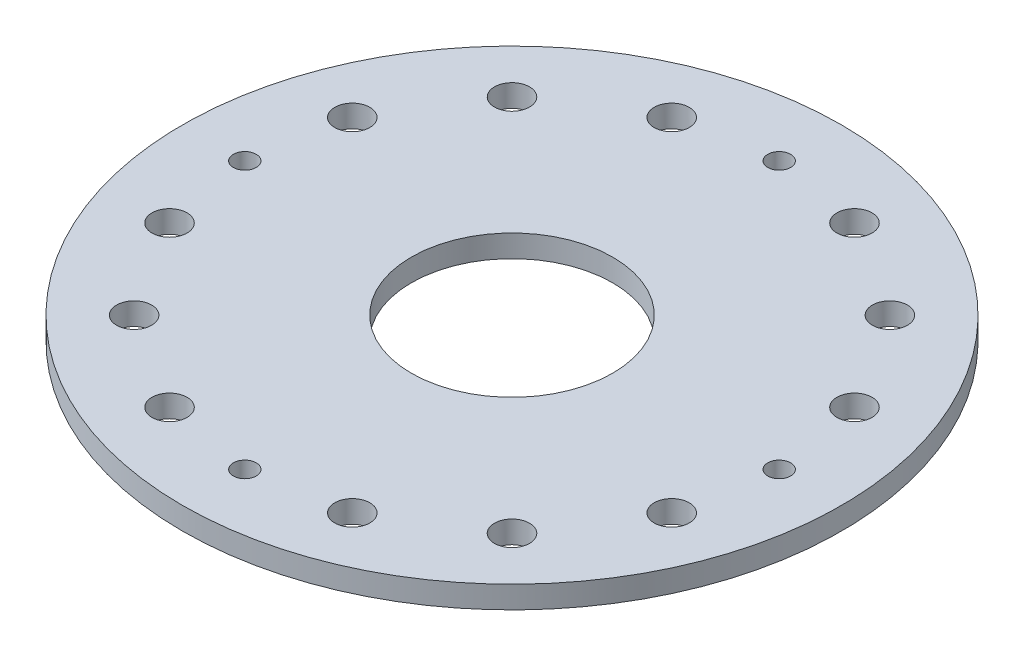
ISO-10303-21;
HEADER;
FILE_DESCRIPTION(('STEP AP214'),'2;1');
FILE_NAME('part.step','',(''),(''),'','','');
FILE_SCHEMA(('AUTOMOTIVE_DESIGN { 1 0 10303 214 1 1 1 1 }'));
ENDSEC;
DATA;
#1=APPLICATION_CONTEXT('core data for automotive mechanical design processes');
#2=APPLICATION_PROTOCOL_DEFINITION('international standard','automotive_design',2000,#1);
#3=PRODUCT_CONTEXT('',#1,'mechanical');
#4=PRODUCT('Part','Part','',(#3));
#5=PRODUCT_RELATED_PRODUCT_CATEGORY('part','',(#4));
#6=PRODUCT_DEFINITION_FORMATION('','',#4);
#7=PRODUCT_DEFINITION_CONTEXT('part definition',#1,'design');
#8=PRODUCT_DEFINITION('design','',#6,#7);
#9=PRODUCT_DEFINITION_SHAPE('','',#8);
#10=(LENGTH_UNIT() NAMED_UNIT(*) SI_UNIT(.MILLI.,.METRE.));
#11=(NAMED_UNIT(*) PLANE_ANGLE_UNIT() SI_UNIT($,.RADIAN.));
#12=(NAMED_UNIT(*) SI_UNIT($,.STERADIAN.) SOLID_ANGLE_UNIT());
#13=UNCERTAINTY_MEASURE_WITH_UNIT(LENGTH_MEASURE(1.E-05),#10,'distance_accuracy_value','');
#14=(GEOMETRIC_REPRESENTATION_CONTEXT(3) GLOBAL_UNCERTAINTY_ASSIGNED_CONTEXT((#13)) GLOBAL_UNIT_ASSIGNED_CONTEXT((#10,
#11,#12)) REPRESENTATION_CONTEXT('',''));
#15=CARTESIAN_POINT('',(0.,0.,0.));
#16=DIRECTION('',(0.,0.,1.));
#17=DIRECTION('',(1.,0.,0.));
#18=AXIS2_PLACEMENT_3D('',#15,#16,#17);
#19=CARTESIAN_POINT('',(0.,3.175,0.));
#20=DIRECTION('',(0.,-1.,0.));
#21=DIRECTION('',(0.,0.,-1.));
#22=AXIS2_PLACEMENT_3D('',#19,#20,#21);
#23=CYLINDRICAL_SURFACE('',#22,46.99);
#24=CARTESIAN_POINT('',(0.,3.175,0.));
#25=DIRECTION('',(0.,1.,0.));
#26=DIRECTION('',(0.,0.,1.));
#27=AXIS2_PLACEMENT_3D('',#24,#25,#26);
#28=CIRCLE('',#27,46.99);
#29=CARTESIAN_POINT('',(0.,3.175,46.99));
#30=VERTEX_POINT('',#29);
#31=EDGE_CURVE('E10',#30,#30,#28,.T.);
#32=ORIENTED_EDGE('',*,*,#31,.F.);
#33=EDGE_LOOP('',(#32));
#34=FACE_BOUND('',#33,.T.);
#35=CARTESIAN_POINT('',(0.,0.,0.));
#36=DIRECTION('',(0.,1.,0.));
#37=DIRECTION('',(0.,0.,1.));
#38=AXIS2_PLACEMENT_3D('',#35,#36,#37);
#39=CIRCLE('',#38,46.99);
#40=CARTESIAN_POINT('',(0.,0.,46.99));
#41=VERTEX_POINT('',#40);
#42=EDGE_CURVE('E38',#41,#41,#39,.T.);
#43=ORIENTED_EDGE('',*,*,#42,.T.);
#44=EDGE_LOOP('',(#43));
#45=FACE_BOUND('',#44,.T.);
#46=ADVANCED_FACE('F31',(#34,#45),#23,.T.);
#47=CARTESIAN_POINT('',(0.,3.175,0.));
#48=DIRECTION('',(0.,1.,0.));
#49=DIRECTION('',(0.,0.,1.));
#50=AXIS2_PLACEMENT_3D('',#47,#48,#49);
#51=PLANE('',#50);
#52=CARTESIAN_POINT('',(35.8022888519431,3.175,-13.0309674607081));
#53=DIRECTION('',(0.,1.,0.));
#54=DIRECTION('',(-0.906307787036654,0.,-0.422618261740691));
#55=AXIS2_PLACEMENT_3D('',#52,#53,#54);
#56=CIRCLE('',#55,2.5);
#57=CARTESIAN_POINT('',(33.5365193843514,3.175,-14.0875131150599));
#58=VERTEX_POINT('',#57);
#59=EDGE_CURVE('E109',#58,#58,#56,.T.);
#60=ORIENTED_EDGE('',*,*,#59,.F.);
#61=EDGE_LOOP('',(#60));
#62=FACE_BOUND('',#61,.T.);
#63=CARTESIAN_POINT('',(13.0309674607078,3.175,35.8022888519432));
#64=DIRECTION('',(0.,1.,0.));
#65=DIRECTION('',(0.4226182617407,0.,-0.90630778703665));
#66=AXIS2_PLACEMENT_3D('',#63,#64,#65);
#67=CIRCLE('',#66,2.5);
#68=CARTESIAN_POINT('',(14.0875131150595,3.175,33.5365193843516));
#69=VERTEX_POINT('',#68);
#70=EDGE_CURVE('E99',#69,#69,#67,.T.);
#71=ORIENTED_EDGE('',*,*,#70,.F.);
#72=EDGE_LOOP('',(#71));
#73=FACE_BOUND('',#72,.T.);
#74=CARTESIAN_POINT('',(-35.8022888519431,3.175,13.0309674607079));
#75=DIRECTION('',(0.,1.,0.));
#76=DIRECTION('',(0.906307787036651,0.,0.422618261740697));
#77=AXIS2_PLACEMENT_3D('',#74,#75,#76);
#78=CIRCLE('',#77,2.5);
#79=CARTESIAN_POINT('',(-33.5365193843515,3.175,14.0875131150596));
#80=VERTEX_POINT('',#79);
#81=EDGE_CURVE('E96',#80,#80,#78,.T.);
#82=ORIENTED_EDGE('',*,*,#81,.F.);
#83=EDGE_LOOP('',(#82));
#84=FACE_BOUND('',#83,.T.);
#85=CARTESIAN_POINT('',(-13.0309674607078,3.175,-35.8022888519432));
#86=DIRECTION('',(0.,1.,0.));
#87=DIRECTION('',(-0.4226182617407,0.,0.90630778703665));
#88=AXIS2_PLACEMENT_3D('',#85,#86,#87);
#89=CIRCLE('',#88,2.5);
#90=CARTESIAN_POINT('',(-14.0875131150595,3.175,-33.5365193843516));
#91=VERTEX_POINT('',#90);
#92=EDGE_CURVE('E93',#91,#91,#89,.T.);
#93=ORIENTED_EDGE('',*,*,#92,.F.);
#94=EDGE_LOOP('',(#93));
#95=FACE_BOUND('',#94,.T.);
#96=CARTESIAN_POINT('',(13.0309674607078,3.175,-35.8022888519432));
#97=DIRECTION('',(0.,1.,0.));
#98=DIRECTION('',(-0.906307787036645,0.,0.42261826174071));
#99=AXIS2_PLACEMENT_3D('',#96,#97,#98);
#100=CIRCLE('',#99,2.5);
#101=CARTESIAN_POINT('',(10.7651979931161,3.175,-34.7457431975914));
#102=VERTEX_POINT('',#101);
#103=EDGE_CURVE('E89',#102,#102,#100,.T.);
#104=ORIENTED_EDGE('',*,*,#103,.F.);
#105=EDGE_LOOP('',(#104));
#106=FACE_BOUND('',#105,.T.);
#107=CARTESIAN_POINT('',(35.8022888519431,3.175,13.0309674607081));
#108=DIRECTION('',(0.,1.,0.));
#109=DIRECTION('',(-0.4226182617407,0.,-0.90630778703665));
#110=AXIS2_PLACEMENT_3D('',#107,#108,#109);
#111=CIRCLE('',#110,2.5);
#112=CARTESIAN_POINT('',(34.7457431975913,3.175,10.7651979931165));
#113=VERTEX_POINT('',#112);
#114=EDGE_CURVE('E85',#113,#113,#111,.T.);
#115=ORIENTED_EDGE('',*,*,#114,.F.);
#116=EDGE_LOOP('',(#115));
#117=FACE_BOUND('',#116,.T.);
#118=CARTESIAN_POINT('',(-13.030967460708,3.175,35.8022888519431));
#119=DIRECTION('',(0.,1.,0.));
#120=DIRECTION('',(0.906307787036648,0.,-0.422618261740703));
#121=AXIS2_PLACEMENT_3D('',#118,#119,#120);
#122=CIRCLE('',#121,2.5);
#123=CARTESIAN_POINT('',(-10.7651979931164,3.175,34.7457431975913));
#124=VERTEX_POINT('',#123);
#125=EDGE_CURVE('E81',#124,#124,#122,.T.);
#126=ORIENTED_EDGE('',*,*,#125,.F.);
#127=EDGE_LOOP('',(#126));
#128=FACE_BOUND('',#127,.T.);
#129=CARTESIAN_POINT('',(-35.8022888519431,3.175,-13.0309674607081));
#130=DIRECTION('',(0.,1.,0.));
#131=DIRECTION('',(0.4226182617407,0.,0.90630778703665));
#132=AXIS2_PLACEMENT_3D('',#129,#130,#131);
#133=CIRCLE('',#132,2.5);
#134=CARTESIAN_POINT('',(-34.7457431975913,3.175,-10.7651979931165));
#135=VERTEX_POINT('',#134);
#136=EDGE_CURVE('E77',#135,#135,#133,.T.);
#137=ORIENTED_EDGE('',*,*,#136,.F.);
#138=EDGE_LOOP('',(#137));
#139=FACE_BOUND('',#138,.T.);
#140=CARTESIAN_POINT('',(26.9407683632073,3.175,-26.9407683632076));
#141=DIRECTION('',(0.,1.,0.));
#142=DIRECTION('',(-1.,0.,0.));
#143=AXIS2_PLACEMENT_3D('',#140,#141,#142);
#144=CIRCLE('',#143,2.5);
#145=CARTESIAN_POINT('',(24.4407683632073,3.175,-26.9407683632076));
#146=VERTEX_POINT('',#145);
#147=EDGE_CURVE('E73',#146,#146,#144,.T.);
#148=ORIENTED_EDGE('',*,*,#147,.F.);
#149=EDGE_LOOP('',(#148));
#150=FACE_BOUND('',#149,.T.);
#151=CARTESIAN_POINT('',(26.9407683632073,3.175,26.9407683632076));
#152=DIRECTION('',(0.,1.,0.));
#153=DIRECTION('',(0.,0.,-1.));
#154=AXIS2_PLACEMENT_3D('',#151,#152,#153);
#155=CIRCLE('',#154,2.5);
#156=CARTESIAN_POINT('',(26.9407683632073,3.175,24.4407683632076));
#157=VERTEX_POINT('',#156);
#158=EDGE_CURVE('E69',#157,#157,#155,.T.);
#159=ORIENTED_EDGE('',*,*,#158,.F.);
#160=EDGE_LOOP('',(#159));
#161=FACE_BOUND('',#160,.T.);
#162=CARTESIAN_POINT('',(-26.9407683632075,3.175,26.9407683632074));
#163=DIRECTION('',(0.,1.,0.));
#164=DIRECTION('',(1.,0.,0.));
#165=AXIS2_PLACEMENT_3D('',#162,#163,#164);
#166=CIRCLE('',#165,2.5);
#167=CARTESIAN_POINT('',(-24.4407683632075,3.175,26.9407683632074));
#168=VERTEX_POINT('',#167);
#169=EDGE_CURVE('E65',#168,#168,#166,.T.);
#170=ORIENTED_EDGE('',*,*,#169,.F.);
#171=EDGE_LOOP('',(#170));
#172=FACE_BOUND('',#171,.T.);
#173=CARTESIAN_POINT('',(-26.9407683632073,3.175,-26.9407683632076));
#174=DIRECTION('',(0.,1.,0.));
#175=DIRECTION('',(0.,0.,1.));
#176=AXIS2_PLACEMENT_3D('',#173,#174,#175);
#177=CIRCLE('',#176,2.5);
#178=CARTESIAN_POINT('',(-26.9407683632073,3.175,-24.4407683632076));
#179=VERTEX_POINT('',#178);
#180=EDGE_CURVE('E61',#179,#179,#177,.T.);
#181=ORIENTED_EDGE('',*,*,#180,.F.);
#182=EDGE_LOOP('',(#181));
#183=FACE_BOUND('',#182,.T.);
#184=CARTESIAN_POINT('',(38.1,3.175,-3.9907631702977E-13));
#185=DIRECTION('',(0.,1.,0.));
#186=DIRECTION('',(0.,0.,1.));
#187=AXIS2_PLACEMENT_3D('',#184,#185,#186);
#188=CIRCLE('',#187,1.63195);
#189=CARTESIAN_POINT('',(38.1,3.175,1.6319499999996));
#190=VERTEX_POINT('',#189);
#191=EDGE_CURVE('E57',#190,#190,#188,.T.);
#192=ORIENTED_EDGE('',*,*,#191,.F.);
#193=EDGE_LOOP('',(#192));
#194=FACE_BOUND('',#193,.T.);
#195=CARTESIAN_POINT('',(0.,3.175,38.1));
#196=DIRECTION('',(0.,1.,0.));
#197=DIRECTION('',(0.,0.,1.));
#198=AXIS2_PLACEMENT_3D('',#195,#196,#197);
#199=CIRCLE('',#198,1.63195);
#200=CARTESIAN_POINT('',(0.,3.175,39.73195));
#201=VERTEX_POINT('',#200);
#202=EDGE_CURVE('E53',#201,#201,#199,.T.);
#203=ORIENTED_EDGE('',*,*,#202,.F.);
#204=EDGE_LOOP('',(#203));
#205=FACE_BOUND('',#204,.T.);
#206=CARTESIAN_POINT('',(-38.1,3.175,1.33025439009923E-13));
#207=DIRECTION('',(0.,1.,0.));
#208=DIRECTION('',(0.,0.,1.));
#209=AXIS2_PLACEMENT_3D('',#206,#207,#208);
#210=CIRCLE('',#209,1.63195);
#211=CARTESIAN_POINT('',(-38.1,3.175,1.63195000000013));
#212=VERTEX_POINT('',#211);
#213=EDGE_CURVE('E52',#212,#212,#210,.T.);
#214=ORIENTED_EDGE('',*,*,#213,.F.);
#215=EDGE_LOOP('',(#214));
#216=FACE_BOUND('',#215,.T.);
#217=CARTESIAN_POINT('',(0.,3.175,-38.1));
#218=DIRECTION('',(0.,1.,0.));
#219=DIRECTION('',(0.,0.,1.));
#220=AXIS2_PLACEMENT_3D('',#217,#218,#219);
#221=CIRCLE('',#220,1.63195);
#222=CARTESIAN_POINT('',(0.,3.175,-36.46805));
#223=VERTEX_POINT('',#222);
#224=EDGE_CURVE('E139',#223,#223,#221,.T.);
#225=ORIENTED_EDGE('',*,*,#224,.F.);
#226=EDGE_LOOP('',(#225));
#227=FACE_BOUND('',#226,.T.);
#228=CARTESIAN_POINT('',(0.,3.175,0.));
#229=DIRECTION('',(0.,1.,0.));
#230=DIRECTION('',(0.,0.,1.));
#231=AXIS2_PLACEMENT_3D('',#228,#229,#230);
#232=CIRCLE('',#231,14.351);
#233=CARTESIAN_POINT('',(0.,3.175,14.351));
#234=VERTEX_POINT('',#233);
#235=EDGE_CURVE('E46',#234,#234,#232,.T.);
#236=ORIENTED_EDGE('',*,*,#235,.F.);
#237=EDGE_LOOP('',(#236));
#238=FACE_BOUND('',#237,.T.);
#239=ORIENTED_EDGE('',*,*,#31,.T.);
#240=EDGE_LOOP('',(#239));
#241=FACE_BOUND('',#240,.T.);
#242=ADVANCED_FACE('F152',(#62,#73,#84,#95,#106,#117,#128,#139,#150,#161,#172,#183,#194,#205,
#216,#227,#238,#241),#51,.T.);
#243=CARTESIAN_POINT('',(0.,0.,0.));
#244=DIRECTION('',(0.,1.,0.));
#245=DIRECTION('',(0.,0.,1.));
#246=AXIS2_PLACEMENT_3D('',#243,#244,#245);
#247=PLANE('',#246);
#248=CARTESIAN_POINT('',(35.8022888519431,0.,-13.0309674607081));
#249=DIRECTION('',(0.,1.,0.));
#250=DIRECTION('',(0.,0.,1.));
#251=AXIS2_PLACEMENT_3D('',#248,#249,#250);
#252=CIRCLE('',#251,2.5);
#253=CARTESIAN_POINT('',(35.8022888519431,0.,-10.5309674607081));
#254=VERTEX_POINT('',#253);
#255=EDGE_CURVE('E34',#254,#254,#252,.T.);
#256=ORIENTED_EDGE('',*,*,#255,.T.);
#257=EDGE_LOOP('',(#256));
#258=FACE_BOUND('',#257,.T.);
#259=CARTESIAN_POINT('',(13.0309674607078,0.,35.8022888519432));
#260=DIRECTION('',(0.,1.,0.));
#261=DIRECTION('',(0.,0.,1.));
#262=AXIS2_PLACEMENT_3D('',#259,#260,#261);
#263=CIRCLE('',#262,2.5);
#264=CARTESIAN_POINT('',(13.0309674607078,0.,38.3022888519432));
#265=VERTEX_POINT('',#264);
#266=EDGE_CURVE('E97',#265,#265,#263,.T.);
#267=ORIENTED_EDGE('',*,*,#266,.T.);
#268=EDGE_LOOP('',(#267));
#269=FACE_BOUND('',#268,.T.);
#270=CARTESIAN_POINT('',(-35.8022888519431,0.,13.0309674607079));
#271=DIRECTION('',(0.,1.,0.));
#272=DIRECTION('',(0.,0.,1.));
#273=AXIS2_PLACEMENT_3D('',#270,#271,#272);
#274=CIRCLE('',#273,2.5);
#275=CARTESIAN_POINT('',(-35.8022888519431,0.,15.5309674607079));
#276=VERTEX_POINT('',#275);
#277=EDGE_CURVE('E94',#276,#276,#274,.T.);
#278=ORIENTED_EDGE('',*,*,#277,.T.);
#279=EDGE_LOOP('',(#278));
#280=FACE_BOUND('',#279,.T.);
#281=CARTESIAN_POINT('',(-13.0309674607078,0.,-35.8022888519432));
#282=DIRECTION('',(0.,1.,0.));
#283=DIRECTION('',(0.,0.,1.));
#284=AXIS2_PLACEMENT_3D('',#281,#282,#283);
#285=CIRCLE('',#284,2.5);
#286=CARTESIAN_POINT('',(-13.0309674607078,0.,-33.3022888519432));
#287=VERTEX_POINT('',#286);
#288=EDGE_CURVE('E90',#287,#287,#285,.T.);
#289=ORIENTED_EDGE('',*,*,#288,.T.);
#290=EDGE_LOOP('',(#289));
#291=FACE_BOUND('',#290,.T.);
#292=CARTESIAN_POINT('',(13.0309674607078,0.,-35.8022888519432));
#293=DIRECTION('',(0.,1.,0.));
#294=DIRECTION('',(0.,0.,1.));
#295=AXIS2_PLACEMENT_3D('',#292,#293,#294);
#296=CIRCLE('',#295,2.5);
#297=CARTESIAN_POINT('',(13.0309674607078,0.,-33.3022888519432));
#298=VERTEX_POINT('',#297);
#299=EDGE_CURVE('E86',#298,#298,#296,.T.);
#300=ORIENTED_EDGE('',*,*,#299,.T.);
#301=EDGE_LOOP('',(#300));
#302=FACE_BOUND('',#301,.T.);
#303=CARTESIAN_POINT('',(35.8022888519431,0.,13.0309674607081));
#304=DIRECTION('',(0.,1.,0.));
#305=DIRECTION('',(0.,0.,1.));
#306=AXIS2_PLACEMENT_3D('',#303,#304,#305);
#307=CIRCLE('',#306,2.5);
#308=CARTESIAN_POINT('',(35.8022888519431,0.,15.5309674607081));
#309=VERTEX_POINT('',#308);
#310=EDGE_CURVE('E82',#309,#309,#307,.T.);
#311=ORIENTED_EDGE('',*,*,#310,.T.);
#312=EDGE_LOOP('',(#311));
#313=FACE_BOUND('',#312,.T.);
#314=CARTESIAN_POINT('',(-13.030967460708,0.,35.8022888519431));
#315=DIRECTION('',(0.,1.,0.));
#316=DIRECTION('',(0.,0.,1.));
#317=AXIS2_PLACEMENT_3D('',#314,#315,#316);
#318=CIRCLE('',#317,2.5);
#319=CARTESIAN_POINT('',(-13.030967460708,0.,38.3022888519431));
#320=VERTEX_POINT('',#319);
#321=EDGE_CURVE('E78',#320,#320,#318,.T.);
#322=ORIENTED_EDGE('',*,*,#321,.T.);
#323=EDGE_LOOP('',(#322));
#324=FACE_BOUND('',#323,.T.);
#325=CARTESIAN_POINT('',(-35.8022888519431,0.,-13.0309674607081));
#326=DIRECTION('',(0.,1.,0.));
#327=DIRECTION('',(0.,0.,1.));
#328=AXIS2_PLACEMENT_3D('',#325,#326,#327);
#329=CIRCLE('',#328,2.5);
#330=CARTESIAN_POINT('',(-35.8022888519431,0.,-10.5309674607081));
#331=VERTEX_POINT('',#330);
#332=EDGE_CURVE('E74',#331,#331,#329,.T.);
#333=ORIENTED_EDGE('',*,*,#332,.T.);
#334=EDGE_LOOP('',(#333));
#335=FACE_BOUND('',#334,.T.);
#336=CARTESIAN_POINT('',(26.9407683632073,0.,-26.9407683632076));
#337=DIRECTION('',(0.,1.,0.));
#338=DIRECTION('',(0.,0.,1.));
#339=AXIS2_PLACEMENT_3D('',#336,#337,#338);
#340=CIRCLE('',#339,2.5);
#341=CARTESIAN_POINT('',(26.9407683632073,0.,-24.4407683632076));
#342=VERTEX_POINT('',#341);
#343=EDGE_CURVE('E70',#342,#342,#340,.T.);
#344=ORIENTED_EDGE('',*,*,#343,.T.);
#345=EDGE_LOOP('',(#344));
#346=FACE_BOUND('',#345,.T.);
#347=CARTESIAN_POINT('',(26.9407683632073,0.,26.9407683632076));
#348=DIRECTION('',(0.,1.,0.));
#349=DIRECTION('',(0.,0.,1.));
#350=AXIS2_PLACEMENT_3D('',#347,#348,#349);
#351=CIRCLE('',#350,2.5);
#352=CARTESIAN_POINT('',(26.9407683632073,0.,29.4407683632076));
#353=VERTEX_POINT('',#352);
#354=EDGE_CURVE('E66',#353,#353,#351,.T.);
#355=ORIENTED_EDGE('',*,*,#354,.T.);
#356=EDGE_LOOP('',(#355));
#357=FACE_BOUND('',#356,.T.);
#358=CARTESIAN_POINT('',(-26.9407683632075,0.,26.9407683632074));
#359=DIRECTION('',(0.,1.,0.));
#360=DIRECTION('',(0.,0.,1.));
#361=AXIS2_PLACEMENT_3D('',#358,#359,#360);
#362=CIRCLE('',#361,2.5);
#363=CARTESIAN_POINT('',(-26.9407683632075,0.,29.4407683632074));
#364=VERTEX_POINT('',#363);
#365=EDGE_CURVE('E62',#364,#364,#362,.T.);
#366=ORIENTED_EDGE('',*,*,#365,.T.);
#367=EDGE_LOOP('',(#366));
#368=FACE_BOUND('',#367,.T.);
#369=CARTESIAN_POINT('',(-26.9407683632073,0.,-26.9407683632076));
#370=DIRECTION('',(0.,1.,0.));
#371=DIRECTION('',(0.,0.,1.));
#372=AXIS2_PLACEMENT_3D('',#369,#370,#371);
#373=CIRCLE('',#372,2.5);
#374=CARTESIAN_POINT('',(-26.9407683632073,0.,-24.4407683632076));
#375=VERTEX_POINT('',#374);
#376=EDGE_CURVE('E58',#375,#375,#373,.T.);
#377=ORIENTED_EDGE('',*,*,#376,.T.);
#378=EDGE_LOOP('',(#377));
#379=FACE_BOUND('',#378,.T.);
#380=CARTESIAN_POINT('',(38.1,0.,-3.9907631702977E-13));
#381=DIRECTION('',(0.,1.,0.));
#382=DIRECTION('',(0.,0.,1.));
#383=AXIS2_PLACEMENT_3D('',#380,#381,#382);
#384=CIRCLE('',#383,1.63195);
#385=CARTESIAN_POINT('',(38.1,0.,1.6319499999996));
#386=VERTEX_POINT('',#385);
#387=EDGE_CURVE('E54',#386,#386,#384,.T.);
#388=ORIENTED_EDGE('',*,*,#387,.T.);
#389=EDGE_LOOP('',(#388));
#390=FACE_BOUND('',#389,.T.);
#391=CARTESIAN_POINT('',(0.,0.,38.1));
#392=DIRECTION('',(0.,1.,0.));
#393=DIRECTION('',(0.,0.,1.));
#394=AXIS2_PLACEMENT_3D('',#391,#392,#393);
#395=CIRCLE('',#394,1.63195);
#396=CARTESIAN_POINT('',(0.,0.,39.73195));
#397=VERTEX_POINT('',#396);
#398=EDGE_CURVE('E49',#397,#397,#395,.T.);
#399=ORIENTED_EDGE('',*,*,#398,.T.);
#400=EDGE_LOOP('',(#399));
#401=FACE_BOUND('',#400,.T.);
#402=CARTESIAN_POINT('',(-38.1,0.,1.33025439009923E-13));
#403=DIRECTION('',(0.,1.,0.));
#404=DIRECTION('',(0.,0.,1.));
#405=AXIS2_PLACEMENT_3D('',#402,#403,#404);
#406=CIRCLE('',#405,1.63195);
#407=CARTESIAN_POINT('',(-38.1,0.,1.63195000000013));
#408=VERTEX_POINT('',#407);
#409=EDGE_CURVE('E136',#408,#408,#406,.T.);
#410=ORIENTED_EDGE('',*,*,#409,.T.);
#411=EDGE_LOOP('',(#410));
#412=FACE_BOUND('',#411,.T.);
#413=CARTESIAN_POINT('',(0.,0.,-38.1));
#414=DIRECTION('',(0.,1.,0.));
#415=DIRECTION('',(0.,0.,1.));
#416=AXIS2_PLACEMENT_3D('',#413,#414,#415);
#417=CIRCLE('',#416,1.63195);
#418=CARTESIAN_POINT('',(0.,0.,-36.46805));
#419=VERTEX_POINT('',#418);
#420=EDGE_CURVE('E142',#419,#419,#417,.T.);
#421=ORIENTED_EDGE('',*,*,#420,.T.);
#422=EDGE_LOOP('',(#421));
#423=FACE_BOUND('',#422,.T.);
#424=CARTESIAN_POINT('',(0.,0.,0.));
#425=DIRECTION('',(0.,1.,0.));
#426=DIRECTION('',(0.,0.,1.));
#427=AXIS2_PLACEMENT_3D('',#424,#425,#426);
#428=CIRCLE('',#427,14.351);
#429=CARTESIAN_POINT('',(0.,0.,14.351));
#430=VERTEX_POINT('',#429);
#431=EDGE_CURVE('E43',#430,#430,#428,.T.);
#432=ORIENTED_EDGE('',*,*,#431,.T.);
#433=EDGE_LOOP('',(#432));
#434=FACE_BOUND('',#433,.T.);
#435=ORIENTED_EDGE('',*,*,#42,.F.);
#436=EDGE_LOOP('',(#435));
#437=FACE_BOUND('',#436,.T.);
#438=ADVANCED_FACE('F154',(#258,#269,#280,#291,#302,#313,#324,#335,#346,#357,#368,#379,#390,
#401,#412,#423,#434,#437),#247,.F.);
#439=CARTESIAN_POINT('',(0.,0.,0.));
#440=DIRECTION('',(0.,1.,0.));
#441=DIRECTION('',(0.,0.,1.));
#442=AXIS2_PLACEMENT_3D('',#439,#440,#441);
#443=CYLINDRICAL_SURFACE('',#442,14.351);
#444=ORIENTED_EDGE('',*,*,#431,.F.);
#445=EDGE_LOOP('',(#444));
#446=FACE_BOUND('',#445,.T.);
#447=ORIENTED_EDGE('',*,*,#235,.T.);
#448=EDGE_LOOP('',(#447));
#449=FACE_BOUND('',#448,.T.);
#450=ADVANCED_FACE('F150',(#446,#449),#443,.F.);
#451=CARTESIAN_POINT('',(0.,3.175,-38.1));
#452=DIRECTION('',(0.,1.,0.));
#453=DIRECTION('',(0.,0.,1.));
#454=AXIS2_PLACEMENT_3D('',#451,#452,#453);
#455=CYLINDRICAL_SURFACE('',#454,1.63195);
#456=ORIENTED_EDGE('',*,*,#224,.T.);
#457=EDGE_LOOP('',(#456));
#458=FACE_BOUND('',#457,.T.);
#459=ORIENTED_EDGE('',*,*,#420,.F.);
#460=EDGE_LOOP('',(#459));
#461=FACE_BOUND('',#460,.T.);
#462=ADVANCED_FACE('F169',(#458,#461),#455,.F.);
#463=CARTESIAN_POINT('',(-38.1,3.175,1.33025439009923E-13));
#464=DIRECTION('',(0.,1.,0.));
#465=DIRECTION('',(0.,0.,1.));
#466=AXIS2_PLACEMENT_3D('',#463,#464,#465);
#467=CYLINDRICAL_SURFACE('',#466,1.63195);
#468=ORIENTED_EDGE('',*,*,#213,.T.);
#469=EDGE_LOOP('',(#468));
#470=FACE_BOUND('',#469,.T.);
#471=ORIENTED_EDGE('',*,*,#409,.F.);
#472=EDGE_LOOP('',(#471));
#473=FACE_BOUND('',#472,.T.);
#474=ADVANCED_FACE('F173',(#470,#473),#467,.F.);
#475=CARTESIAN_POINT('',(0.,3.175,38.1));
#476=DIRECTION('',(0.,1.,0.));
#477=DIRECTION('',(0.,0.,1.));
#478=AXIS2_PLACEMENT_3D('',#475,#476,#477);
#479=CYLINDRICAL_SURFACE('',#478,1.63195);
#480=ORIENTED_EDGE('',*,*,#202,.T.);
#481=EDGE_LOOP('',(#480));
#482=FACE_BOUND('',#481,.T.);
#483=ORIENTED_EDGE('',*,*,#398,.F.);
#484=EDGE_LOOP('',(#483));
#485=FACE_BOUND('',#484,.T.);
#486=ADVANCED_FACE('F177',(#482,#485),#479,.F.);
#487=CARTESIAN_POINT('',(38.1,3.175,-3.9907631702977E-13));
#488=DIRECTION('',(0.,1.,0.));
#489=DIRECTION('',(0.,0.,1.));
#490=AXIS2_PLACEMENT_3D('',#487,#488,#489);
#491=CYLINDRICAL_SURFACE('',#490,1.63195);
#492=ORIENTED_EDGE('',*,*,#191,.T.);
#493=EDGE_LOOP('',(#492));
#494=FACE_BOUND('',#493,.T.);
#495=ORIENTED_EDGE('',*,*,#387,.F.);
#496=EDGE_LOOP('',(#495));
#497=FACE_BOUND('',#496,.T.);
#498=ADVANCED_FACE('F181',(#494,#497),#491,.F.);
#499=CARTESIAN_POINT('',(-26.9407683632073,-1.905,-26.9407683632076));
#500=DIRECTION('',(0.,1.,0.));
#501=DIRECTION('',(0.,0.,1.));
#502=AXIS2_PLACEMENT_3D('',#499,#500,#501);
#503=CYLINDRICAL_SURFACE('',#502,2.5);
#504=ORIENTED_EDGE('',*,*,#180,.T.);
#505=EDGE_LOOP('',(#504));
#506=FACE_BOUND('',#505,.T.);
#507=ORIENTED_EDGE('',*,*,#376,.F.);
#508=EDGE_LOOP('',(#507));
#509=FACE_BOUND('',#508,.T.);
#510=ADVANCED_FACE('F185',(#506,#509),#503,.F.);
#511=CARTESIAN_POINT('',(-26.9407683632075,-1.905,26.9407683632074));
#512=DIRECTION('',(0.,1.,0.));
#513=DIRECTION('',(0.,0.,1.));
#514=AXIS2_PLACEMENT_3D('',#511,#512,#513);
#515=CYLINDRICAL_SURFACE('',#514,2.5);
#516=ORIENTED_EDGE('',*,*,#169,.T.);
#517=EDGE_LOOP('',(#516));
#518=FACE_BOUND('',#517,.T.);
#519=ORIENTED_EDGE('',*,*,#365,.F.);
#520=EDGE_LOOP('',(#519));
#521=FACE_BOUND('',#520,.T.);
#522=ADVANCED_FACE('F189',(#518,#521),#515,.F.);
#523=CARTESIAN_POINT('',(26.9407683632073,-1.905,26.9407683632076));
#524=DIRECTION('',(0.,1.,0.));
#525=DIRECTION('',(0.,0.,1.));
#526=AXIS2_PLACEMENT_3D('',#523,#524,#525);
#527=CYLINDRICAL_SURFACE('',#526,2.5);
#528=ORIENTED_EDGE('',*,*,#158,.T.);
#529=EDGE_LOOP('',(#528));
#530=FACE_BOUND('',#529,.T.);
#531=ORIENTED_EDGE('',*,*,#354,.F.);
#532=EDGE_LOOP('',(#531));
#533=FACE_BOUND('',#532,.T.);
#534=ADVANCED_FACE('F193',(#530,#533),#527,.F.);
#535=CARTESIAN_POINT('',(26.9407683632073,-1.905,-26.9407683632076));
#536=DIRECTION('',(0.,1.,0.));
#537=DIRECTION('',(0.,0.,1.));
#538=AXIS2_PLACEMENT_3D('',#535,#536,#537);
#539=CYLINDRICAL_SURFACE('',#538,2.5);
#540=ORIENTED_EDGE('',*,*,#147,.T.);
#541=EDGE_LOOP('',(#540));
#542=FACE_BOUND('',#541,.T.);
#543=ORIENTED_EDGE('',*,*,#343,.F.);
#544=EDGE_LOOP('',(#543));
#545=FACE_BOUND('',#544,.T.);
#546=ADVANCED_FACE('F197',(#542,#545),#539,.F.);
#547=CARTESIAN_POINT('',(-35.8022888519431,-1.905,-13.0309674607081));
#548=DIRECTION('',(0.,1.,0.));
#549=DIRECTION('',(0.,0.,1.));
#550=AXIS2_PLACEMENT_3D('',#547,#548,#549);
#551=CYLINDRICAL_SURFACE('',#550,2.5);
#552=ORIENTED_EDGE('',*,*,#136,.T.);
#553=EDGE_LOOP('',(#552));
#554=FACE_BOUND('',#553,.T.);
#555=ORIENTED_EDGE('',*,*,#332,.F.);
#556=EDGE_LOOP('',(#555));
#557=FACE_BOUND('',#556,.T.);
#558=ADVANCED_FACE('F201',(#554,#557),#551,.F.);
#559=CARTESIAN_POINT('',(-13.030967460708,-1.905,35.8022888519431));
#560=DIRECTION('',(0.,1.,0.));
#561=DIRECTION('',(0.,0.,1.));
#562=AXIS2_PLACEMENT_3D('',#559,#560,#561);
#563=CYLINDRICAL_SURFACE('',#562,2.5);
#564=ORIENTED_EDGE('',*,*,#125,.T.);
#565=EDGE_LOOP('',(#564));
#566=FACE_BOUND('',#565,.T.);
#567=ORIENTED_EDGE('',*,*,#321,.F.);
#568=EDGE_LOOP('',(#567));
#569=FACE_BOUND('',#568,.T.);
#570=ADVANCED_FACE('F205',(#566,#569),#563,.F.);
#571=CARTESIAN_POINT('',(35.8022888519431,-1.905,13.0309674607081));
#572=DIRECTION('',(0.,1.,0.));
#573=DIRECTION('',(0.,0.,1.));
#574=AXIS2_PLACEMENT_3D('',#571,#572,#573);
#575=CYLINDRICAL_SURFACE('',#574,2.5);
#576=ORIENTED_EDGE('',*,*,#114,.T.);
#577=EDGE_LOOP('',(#576));
#578=FACE_BOUND('',#577,.T.);
#579=ORIENTED_EDGE('',*,*,#310,.F.);
#580=EDGE_LOOP('',(#579));
#581=FACE_BOUND('',#580,.T.);
#582=ADVANCED_FACE('F209',(#578,#581),#575,.F.);
#583=CARTESIAN_POINT('',(13.0309674607078,-1.905,-35.8022888519432));
#584=DIRECTION('',(0.,1.,0.));
#585=DIRECTION('',(0.,0.,1.));
#586=AXIS2_PLACEMENT_3D('',#583,#584,#585);
#587=CYLINDRICAL_SURFACE('',#586,2.5);
#588=ORIENTED_EDGE('',*,*,#103,.T.);
#589=EDGE_LOOP('',(#588));
#590=FACE_BOUND('',#589,.T.);
#591=ORIENTED_EDGE('',*,*,#299,.F.);
#592=EDGE_LOOP('',(#591));
#593=FACE_BOUND('',#592,.T.);
#594=ADVANCED_FACE('F213',(#590,#593),#587,.F.);
#595=CARTESIAN_POINT('',(-13.0309674607078,-1.905,-35.8022888519432));
#596=DIRECTION('',(0.,1.,0.));
#597=DIRECTION('',(0.,0.,1.));
#598=AXIS2_PLACEMENT_3D('',#595,#596,#597);
#599=CYLINDRICAL_SURFACE('',#598,2.5);
#600=ORIENTED_EDGE('',*,*,#92,.T.);
#601=EDGE_LOOP('',(#600));
#602=FACE_BOUND('',#601,.T.);
#603=ORIENTED_EDGE('',*,*,#288,.F.);
#604=EDGE_LOOP('',(#603));
#605=FACE_BOUND('',#604,.T.);
#606=ADVANCED_FACE('F217',(#602,#605),#599,.F.);
#607=CARTESIAN_POINT('',(-35.8022888519431,-1.905,13.0309674607079));
#608=DIRECTION('',(0.,1.,0.));
#609=DIRECTION('',(0.,0.,1.));
#610=AXIS2_PLACEMENT_3D('',#607,#608,#609);
#611=CYLINDRICAL_SURFACE('',#610,2.5);
#612=ORIENTED_EDGE('',*,*,#81,.T.);
#613=EDGE_LOOP('',(#612));
#614=FACE_BOUND('',#613,.T.);
#615=ORIENTED_EDGE('',*,*,#277,.F.);
#616=EDGE_LOOP('',(#615));
#617=FACE_BOUND('',#616,.T.);
#618=ADVANCED_FACE('F221',(#614,#617),#611,.F.);
#619=CARTESIAN_POINT('',(13.0309674607078,-1.905,35.8022888519432));
#620=DIRECTION('',(0.,1.,0.));
#621=DIRECTION('',(0.,0.,1.));
#622=AXIS2_PLACEMENT_3D('',#619,#620,#621);
#623=CYLINDRICAL_SURFACE('',#622,2.5);
#624=ORIENTED_EDGE('',*,*,#70,.T.);
#625=EDGE_LOOP('',(#624));
#626=FACE_BOUND('',#625,.T.);
#627=ORIENTED_EDGE('',*,*,#266,.F.);
#628=EDGE_LOOP('',(#627));
#629=FACE_BOUND('',#628,.T.);
#630=ADVANCED_FACE('F225',(#626,#629),#623,.F.);
#631=CARTESIAN_POINT('',(35.8022888519431,-1.905,-13.0309674607081));
#632=DIRECTION('',(0.,1.,0.));
#633=DIRECTION('',(0.,0.,1.));
#634=AXIS2_PLACEMENT_3D('',#631,#632,#633);
#635=CYLINDRICAL_SURFACE('',#634,2.5);
#636=ORIENTED_EDGE('',*,*,#59,.T.);
#637=EDGE_LOOP('',(#636));
#638=FACE_BOUND('',#637,.T.);
#639=ORIENTED_EDGE('',*,*,#255,.F.);
#640=EDGE_LOOP('',(#639));
#641=FACE_BOUND('',#640,.T.);
#642=ADVANCED_FACE('F229',(#638,#641),#635,.F.);
#643=CLOSED_SHELL('',(#46,#242,#438,#450,#462,#474,#486,#498,#510,#522,#534,#546,#558,#570,#582,
#594,#606,#618,#630,#642));
#644=MANIFOLD_SOLID_BREP('B2',#643);
#645=ADVANCED_BREP_SHAPE_REPRESENTATION('',(#18,#644),#14);
#646=SHAPE_DEFINITION_REPRESENTATION(#9,#645);
ENDSEC;
END-ISO-10303-21;
